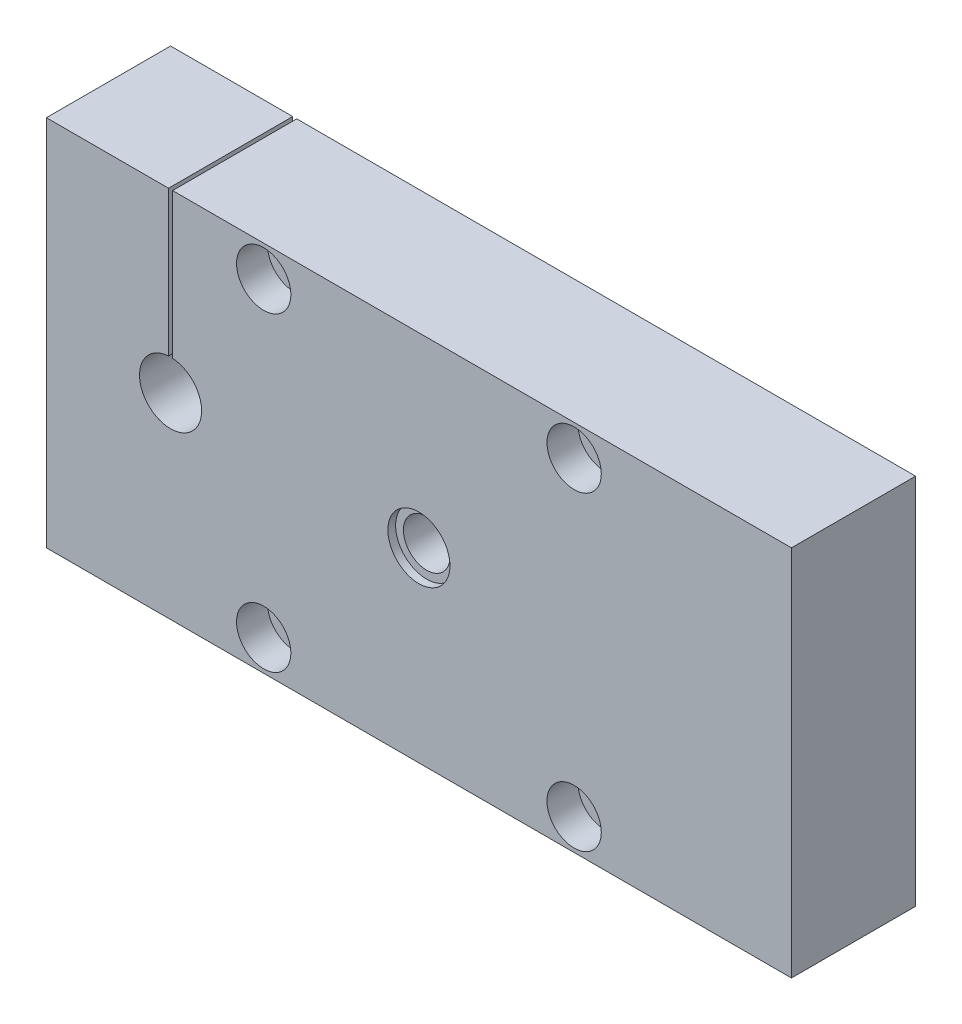
ISO-10303-21;
HEADER;
FILE_DESCRIPTION(('STEP AP214'),'2;1');
FILE_NAME('part.step','',(''),(''),'','','');
FILE_SCHEMA(('AUTOMOTIVE_DESIGN { 1 0 10303 214 1 1 1 1 }'));
ENDSEC;
DATA;
#1=APPLICATION_CONTEXT('core data for automotive mechanical design processes');
#2=APPLICATION_PROTOCOL_DEFINITION('international standard','automotive_design',2000,#1);
#3=PRODUCT_CONTEXT('',#1,'mechanical');
#4=PRODUCT('Part','Part','',(#3));
#5=PRODUCT_RELATED_PRODUCT_CATEGORY('part','',(#4));
#6=PRODUCT_DEFINITION_FORMATION('','',#4);
#7=PRODUCT_DEFINITION_CONTEXT('part definition',#1,'design');
#8=PRODUCT_DEFINITION('design','',#6,#7);
#9=PRODUCT_DEFINITION_SHAPE('','',#8);
#10=(LENGTH_UNIT() NAMED_UNIT(*) SI_UNIT(.MILLI.,.METRE.));
#11=(NAMED_UNIT(*) PLANE_ANGLE_UNIT() SI_UNIT($,.RADIAN.));
#12=(NAMED_UNIT(*) SI_UNIT($,.STERADIAN.) SOLID_ANGLE_UNIT());
#13=UNCERTAINTY_MEASURE_WITH_UNIT(LENGTH_MEASURE(1.E-05),#10,'distance_accuracy_value','');
#14=(GEOMETRIC_REPRESENTATION_CONTEXT(3) GLOBAL_UNCERTAINTY_ASSIGNED_CONTEXT((#13)) GLOBAL_UNIT_ASSIGNED_CONTEXT((#10,
#11,#12)) REPRESENTATION_CONTEXT('',''));
#15=CARTESIAN_POINT('',(0.,0.,0.));
#16=DIRECTION('',(0.,0.,1.));
#17=DIRECTION('',(1.,0.,0.));
#18=AXIS2_PLACEMENT_3D('',#15,#16,#17);
#19=CARTESIAN_POINT('',(-75.7895546636086,70.262996941896,25.4));
#20=DIRECTION('',(0.,-1.,0.));
#21=DIRECTION('',(0.,0.,-1.));
#22=AXIS2_PLACEMENT_3D('',#19,#20,#21);
#23=PLANE('',#22);
#24=DIRECTION('',(-1.,0.,0.));
#25=VECTOR('',#24,1.);
#26=CARTESIAN_POINT('',(-75.7895546636086,70.262996941896,25.4));
#27=LINE('',#26,#25);
#28=CARTESIAN_POINT('',(-50.8023046636086,70.262996941896,25.4));
#29=VERTEX_POINT('',#28);
#30=CARTESIAN_POINT('',(-75.7895546636086,70.262996941896,25.4));
#31=VERTEX_POINT('',#30);
#32=EDGE_CURVE('E165',#29,#31,#27,.T.);
#33=ORIENTED_EDGE('',*,*,#32,.F.);
#34=DIRECTION('',(0.,0.,1.));
#35=VECTOR('',#34,1.);
#36=CARTESIAN_POINT('',(-50.8023046636086,70.262996941896,0.));
#37=LINE('',#36,#35);
#38=CARTESIAN_POINT('',(-50.8023046636086,70.262996941896,0.));
#39=VERTEX_POINT('',#38);
#40=EDGE_CURVE('E565',#39,#29,#37,.T.);
#41=ORIENTED_EDGE('',*,*,#40,.F.);
#42=DIRECTION('',(-1.,0.,0.));
#43=VECTOR('',#42,1.);
#44=CARTESIAN_POINT('',(-75.7895546636086,70.262996941896,0.));
#45=LINE('',#44,#43);
#46=CARTESIAN_POINT('',(-75.7895546636086,70.262996941896,0.));
#47=VERTEX_POINT('',#46);
#48=EDGE_CURVE('E137',#39,#47,#45,.T.);
#49=ORIENTED_EDGE('',*,*,#48,.T.);
#50=DIRECTION('',(0.,0.,-1.));
#51=VECTOR('',#50,1.);
#52=CARTESIAN_POINT('',(-75.7895546636086,70.262996941896,25.4));
#53=LINE('',#52,#51);
#54=EDGE_CURVE('E169',#31,#47,#53,.T.);
#55=ORIENTED_EDGE('',*,*,#54,.F.);
#56=EDGE_LOOP('',(#33,#41,#49,#55));
#57=FACE_BOUND('',#56,.T.);
#58=ADVANCED_FACE('F33',(#57),#23,.F.);
#59=CARTESIAN_POINT('',(0.410445336391438,32.162996941896,25.4));
#60=DIRECTION('',(0.,0.,1.));
#61=DIRECTION('',(1.,0.,0.));
#62=AXIS2_PLACEMENT_3D('',#59,#60,#61);
#63=CYLINDRICAL_SURFACE('',#62,4.76250000000001);
#64=CARTESIAN_POINT('',(0.410445336391438,32.162996941896,23.8125));
#65=DIRECTION('',(0.,0.,1.));
#66=DIRECTION('',(1.,0.,0.));
#67=AXIS2_PLACEMENT_3D('',#64,#65,#66);
#68=CIRCLE('',#67,4.76250000000001);
#69=CARTESIAN_POINT('',(5.17294533639145,32.162996941896,23.8125));
#70=VERTEX_POINT('',#69);
#71=EDGE_CURVE('E153',#70,#70,#68,.T.);
#72=ORIENTED_EDGE('',*,*,#71,.T.);
#73=EDGE_LOOP('',(#72));
#74=FACE_BOUND('',#73,.T.);
#75=CARTESIAN_POINT('',(0.410445336391438,32.162996941896,12.7));
#76=DIRECTION('',(0.,0.,-1.));
#77=DIRECTION('',(-1.,0.,0.));
#78=AXIS2_PLACEMENT_3D('',#75,#76,#77);
#79=CIRCLE('',#78,4.76250000000001);
#80=CARTESIAN_POINT('',(-4.35205466360857,32.162996941896,12.7));
#81=VERTEX_POINT('',#80);
#82=EDGE_CURVE('E37',#81,#81,#79,.F.);
#83=ORIENTED_EDGE('',*,*,#82,.F.);
#84=EDGE_LOOP('',(#83));
#85=FACE_BOUND('',#84,.T.);
#86=ADVANCED_FACE('F323',(#74,#85),#63,.F.);
#87=CARTESIAN_POINT('',(-75.7895546636086,70.262996941896,25.4));
#88=DIRECTION('',(1.,0.,0.));
#89=DIRECTION('',(0.,1.,0.));
#90=AXIS2_PLACEMENT_3D('',#87,#88,#89);
#91=PLANE('',#90);
#92=DIRECTION('',(0.,-1.,0.));
#93=VECTOR('',#92,1.);
#94=CARTESIAN_POINT('',(-75.7895546636086,70.262996941896,0.));
#95=LINE('',#94,#93);
#96=CARTESIAN_POINT('',(-75.7895546636086,-5.93700305810398,0.));
#97=VERTEX_POINT('',#96);
#98=EDGE_CURVE('E156',#47,#97,#95,.T.);
#99=ORIENTED_EDGE('',*,*,#98,.T.);
#100=DIRECTION('',(0.,0.,-1.));
#101=VECTOR('',#100,1.);
#102=CARTESIAN_POINT('',(-75.7895546636086,-5.93700305810398,25.4));
#103=LINE('',#102,#101);
#104=CARTESIAN_POINT('',(-75.7895546636086,-5.93700305810398,25.4));
#105=VERTEX_POINT('',#104);
#106=EDGE_CURVE('E11',#105,#97,#103,.T.);
#107=ORIENTED_EDGE('',*,*,#106,.F.);
#108=DIRECTION('',(0.,-1.,0.));
#109=VECTOR('',#108,1.);
#110=CARTESIAN_POINT('',(-75.7895546636086,70.262996941896,25.4));
#111=LINE('',#110,#109);
#112=EDGE_CURVE('E157',#31,#105,#111,.T.);
#113=ORIENTED_EDGE('',*,*,#112,.F.);
#114=ORIENTED_EDGE('',*,*,#54,.T.);
#115=EDGE_LOOP('',(#99,#107,#113,#114));
#116=FACE_BOUND('',#115,.T.);
#117=ADVANCED_FACE('F35',(#116),#91,.F.);
#118=CARTESIAN_POINT('',(-75.7895546636086,-5.93700305810398,25.4));
#119=DIRECTION('',(0.,1.,0.));
#120=DIRECTION('',(0.,0.,1.));
#121=AXIS2_PLACEMENT_3D('',#118,#119,#120);
#122=PLANE('',#121);
#123=DIRECTION('',(1.,0.,0.));
#124=VECTOR('',#123,1.);
#125=CARTESIAN_POINT('',(-75.7895546636086,-5.93700305810398,0.));
#126=LINE('',#125,#124);
#127=CARTESIAN_POINT('',(-12.2895546636086,-5.93700305810398,0.));
#128=VERTEX_POINT('',#127);
#129=EDGE_CURVE('E173',#97,#128,#126,.T.);
#130=ORIENTED_EDGE('',*,*,#129,.T.);
#131=DIRECTION('',(0.,0.,-1.));
#132=VECTOR('',#131,1.);
#133=CARTESIAN_POINT('',(-12.2895546636086,-5.93700305810398,12.7));
#134=LINE('',#133,#132);
#135=CARTESIAN_POINT('',(-12.2895546636086,-5.93700305810398,12.7));
#136=VERTEX_POINT('',#135);
#137=EDGE_CURVE('E228',#136,#128,#134,.T.);
#138=ORIENTED_EDGE('',*,*,#137,.F.);
#139=DIRECTION('',(-1.,0.,0.));
#140=VECTOR('',#139,1.);
#141=CARTESIAN_POINT('',(13.1104453363914,-5.93700305810398,12.7));
#142=LINE('',#141,#140);
#143=CARTESIAN_POINT('',(13.1104453363914,-5.93700305810398,12.7));
#144=VERTEX_POINT('',#143);
#145=EDGE_CURVE('E571',#144,#136,#142,.T.);
#146=ORIENTED_EDGE('',*,*,#145,.F.);
#147=DIRECTION('',(0.,0.,-1.));
#148=VECTOR('',#147,1.);
#149=CARTESIAN_POINT('',(13.1104453363914,-5.93700305810398,12.7));
#150=LINE('',#149,#148);
#151=CARTESIAN_POINT('',(13.1104453363914,-5.93700305810398,0.));
#152=VERTEX_POINT('',#151);
#153=EDGE_CURVE('E230',#144,#152,#150,.T.);
#154=ORIENTED_EDGE('',*,*,#153,.T.);
#155=CARTESIAN_POINT('',(76.6104453363914,-5.93700305810398,0.));
#156=VERTEX_POINT('',#155);
#157=EDGE_CURVE('E172',#152,#156,#126,.T.);
#158=ORIENTED_EDGE('',*,*,#157,.T.);
#159=DIRECTION('',(0.,0.,-1.));
#160=VECTOR('',#159,1.);
#161=CARTESIAN_POINT('',(76.6104453363914,-5.93700305810398,25.4));
#162=LINE('',#161,#160);
#163=CARTESIAN_POINT('',(76.6104453363914,-5.93700305810398,25.4));
#164=VERTEX_POINT('',#163);
#165=EDGE_CURVE('E42',#164,#156,#162,.T.);
#166=ORIENTED_EDGE('',*,*,#165,.F.);
#167=DIRECTION('',(1.,0.,0.));
#168=VECTOR('',#167,1.);
#169=CARTESIAN_POINT('',(-75.7895546636086,-5.93700305810398,25.4));
#170=LINE('',#169,#168);
#171=EDGE_CURVE('E160',#105,#164,#170,.T.);
#172=ORIENTED_EDGE('',*,*,#171,.F.);
#173=ORIENTED_EDGE('',*,*,#106,.T.);
#174=EDGE_LOOP('',(#130,#138,#146,#154,#158,#166,#172,#173));
#175=FACE_BOUND('',#174,.T.);
#176=ADVANCED_FACE('F207',(#175),#122,.F.);
#177=CARTESIAN_POINT('',(76.6104453363914,70.262996941896,25.4));
#178=DIRECTION('',(-1.,0.,0.));
#179=DIRECTION('',(0.,-1.,0.));
#180=AXIS2_PLACEMENT_3D('',#177,#178,#179);
#181=PLANE('',#180);
#182=DIRECTION('',(0.,1.,0.));
#183=VECTOR('',#182,1.);
#184=CARTESIAN_POINT('',(76.6104453363914,70.262996941896,0.));
#185=LINE('',#184,#183);
#186=CARTESIAN_POINT('',(76.6104453363914,70.262996941896,0.));
#187=VERTEX_POINT('',#186);
#188=EDGE_CURVE('E176',#156,#187,#185,.T.);
#189=ORIENTED_EDGE('',*,*,#188,.T.);
#190=DIRECTION('',(0.,0.,-1.));
#191=VECTOR('',#190,1.);
#192=CARTESIAN_POINT('',(76.6104453363914,70.262996941896,25.4));
#193=LINE('',#192,#191);
#194=CARTESIAN_POINT('',(76.6104453363914,70.262996941896,25.4));
#195=VERTEX_POINT('',#194);
#196=EDGE_CURVE('E182',#195,#187,#193,.T.);
#197=ORIENTED_EDGE('',*,*,#196,.F.);
#198=DIRECTION('',(0.,1.,0.));
#199=VECTOR('',#198,1.);
#200=CARTESIAN_POINT('',(76.6104453363914,70.262996941896,25.4));
#201=LINE('',#200,#199);
#202=EDGE_CURVE('E163',#164,#195,#201,.T.);
#203=ORIENTED_EDGE('',*,*,#202,.F.);
#204=ORIENTED_EDGE('',*,*,#165,.T.);
#205=EDGE_LOOP('',(#189,#197,#203,#204));
#206=FACE_BOUND('',#205,.T.);
#207=ADVANCED_FACE('F190',(#206),#181,.F.);
#208=CARTESIAN_POINT('',(-49.9768046636086,70.262996941896,0.));
#209=VERTEX_POINT('',#208);
#210=EDGE_CURVE('E161',#187,#209,#45,.T.);
#211=ORIENTED_EDGE('',*,*,#210,.T.);
#212=DIRECTION('',(0.,0.,1.));
#213=VECTOR('',#212,1.);
#214=CARTESIAN_POINT('',(-49.9768046636086,70.262996941896,0.));
#215=LINE('',#214,#213);
#216=CARTESIAN_POINT('',(-49.9768046636086,70.262996941896,25.4));
#217=VERTEX_POINT('',#216);
#218=EDGE_CURVE('E200',#209,#217,#215,.T.);
#219=ORIENTED_EDGE('',*,*,#218,.T.);
#220=EDGE_CURVE('E166',#195,#217,#27,.T.);
#221=ORIENTED_EDGE('',*,*,#220,.F.);
#222=ORIENTED_EDGE('',*,*,#196,.T.);
#223=EDGE_LOOP('',(#211,#219,#221,#222));
#224=FACE_BOUND('',#223,.T.);
#225=ADVANCED_FACE('F198',(#224),#23,.F.);
#226=CARTESIAN_POINT('',(-75.7895546636086,-5.93700305810398,25.4));
#227=DIRECTION('',(0.,0.,1.));
#228=DIRECTION('',(1.,0.,0.));
#229=AXIS2_PLACEMENT_3D('',#226,#227,#228);
#230=PLANE('',#229);
#231=DIRECTION('',(0.,-1.,0.));
#232=VECTOR('',#231,1.);
#233=CARTESIAN_POINT('',(-50.8023046636086,40.5442683679513,25.4));
#234=LINE('',#233,#232);
#235=CARTESIAN_POINT('',(-50.8023046636084,40.5442683679513,25.4));
#236=VERTEX_POINT('',#235);
#237=EDGE_CURVE('E49',#29,#236,#234,.T.);
#238=ORIENTED_EDGE('',*,*,#237,.F.);
#239=ORIENTED_EDGE('',*,*,#32,.T.);
#240=ORIENTED_EDGE('',*,*,#112,.T.);
#241=ORIENTED_EDGE('',*,*,#171,.T.);
#242=ORIENTED_EDGE('',*,*,#202,.T.);
#243=ORIENTED_EDGE('',*,*,#220,.T.);
#244=DIRECTION('',(0.,1.,0.));
#245=VECTOR('',#244,1.);
#246=CARTESIAN_POINT('',(-49.9768046636086,40.5442683679513,25.4));
#247=LINE('',#246,#245);
#248=CARTESIAN_POINT('',(-49.9768046636086,40.5442683679513,25.4));
#249=VERTEX_POINT('',#248);
#250=EDGE_CURVE('E138',#249,#217,#247,.T.);
#251=ORIENTED_EDGE('',*,*,#250,.F.);
#252=CARTESIAN_POINT('',(-50.3895546636086,34.207696941896,25.4));
#253=DIRECTION('',(0.,0.,1.));
#254=DIRECTION('',(1.,0.,0.));
#255=AXIS2_PLACEMENT_3D('',#252,#253,#254);
#256=CIRCLE('',#255,6.35);
#257=EDGE_CURVE('E142',#236,#249,#256,.T.);
#258=ORIENTED_EDGE('',*,*,#257,.F.);
#259=EDGE_LOOP('',(#238,#239,#240,#241,#242,#243,#251,#258));
#260=FACE_BOUND('',#259,.T.);
#261=CARTESIAN_POINT('',(-31.3395546636086,63.912996941896,25.4));
#262=DIRECTION('',(0.,0.,1.));
#263=DIRECTION('',(1.,0.,0.));
#264=AXIS2_PLACEMENT_3D('',#261,#262,#263);
#265=CIRCLE('',#264,5.55625);
#266=CARTESIAN_POINT('',(-25.7833046636086,63.912996941896,25.4));
#267=VERTEX_POINT('',#266);
#268=EDGE_CURVE('E237',#267,#267,#265,.T.);
#269=ORIENTED_EDGE('',*,*,#268,.F.);
#270=EDGE_LOOP('',(#269));
#271=FACE_BOUND('',#270,.T.);
#272=CARTESIAN_POINT('',(-31.3395546636086,0.412996941896018,25.4));
#273=DIRECTION('',(0.,0.,1.));
#274=DIRECTION('',(1.,0.,0.));
#275=AXIS2_PLACEMENT_3D('',#272,#273,#274);
#276=CIRCLE('',#275,5.55625);
#277=CARTESIAN_POINT('',(-25.7833046636086,0.412996941896018,25.4));
#278=VERTEX_POINT('',#277);
#279=EDGE_CURVE('E249',#278,#278,#276,.T.);
#280=ORIENTED_EDGE('',*,*,#279,.F.);
#281=EDGE_LOOP('',(#280));
#282=FACE_BOUND('',#281,.T.);
#283=CARTESIAN_POINT('',(32.1604453363914,0.412996941896018,25.4));
#284=DIRECTION('',(0.,0.,1.));
#285=DIRECTION('',(1.,0.,0.));
#286=AXIS2_PLACEMENT_3D('',#283,#284,#285);
#287=CIRCLE('',#286,5.55625);
#288=CARTESIAN_POINT('',(37.7166953363914,0.412996941896018,25.4));
#289=VERTEX_POINT('',#288);
#290=EDGE_CURVE('E261',#289,#289,#287,.T.);
#291=ORIENTED_EDGE('',*,*,#290,.F.);
#292=EDGE_LOOP('',(#291));
#293=FACE_BOUND('',#292,.T.);
#294=CARTESIAN_POINT('',(32.1604453363914,63.912996941896,25.4));
#295=DIRECTION('',(0.,0.,1.));
#296=DIRECTION('',(1.,0.,0.));
#297=AXIS2_PLACEMENT_3D('',#294,#295,#296);
#298=CIRCLE('',#297,5.55625);
#299=CARTESIAN_POINT('',(37.7166953363914,63.912996941896,25.4));
#300=VERTEX_POINT('',#299);
#301=EDGE_CURVE('E273',#300,#300,#298,.T.);
#302=ORIENTED_EDGE('',*,*,#301,.F.);
#303=EDGE_LOOP('',(#302));
#304=FACE_BOUND('',#303,.T.);
#305=CARTESIAN_POINT('',(0.410445336391438,32.162996941896,25.4));
#306=DIRECTION('',(0.,0.,1.));
#307=DIRECTION('',(1.,0.,0.));
#308=AXIS2_PLACEMENT_3D('',#305,#306,#307);
#309=CIRCLE('',#308,6.35000000000001);
#310=CARTESIAN_POINT('',(6.76044533639145,32.162996941896,25.4));
#311=VERTEX_POINT('',#310);
#312=EDGE_CURVE('E141',#311,#311,#309,.T.);
#313=ORIENTED_EDGE('',*,*,#312,.F.);
#314=EDGE_LOOP('',(#313));
#315=FACE_BOUND('',#314,.T.);
#316=ADVANCED_FACE('F203',(#260,#271,#282,#293,#304,#315),#230,.T.);
#317=CARTESIAN_POINT('',(-75.7895546636086,-5.93700305810398,0.));
#318=DIRECTION('',(0.,0.,1.));
#319=DIRECTION('',(1.,0.,0.));
#320=AXIS2_PLACEMENT_3D('',#317,#318,#319);
#321=PLANE('',#320);
#322=CARTESIAN_POINT('',(-31.3395546636086,63.912996941896,0.));
#323=DIRECTION('',(0.,0.,1.));
#324=DIRECTION('',(1.,0.,0.));
#325=AXIS2_PLACEMENT_3D('',#322,#323,#324);
#326=CIRCLE('',#325,3.37819999999999);
#327=CARTESIAN_POINT('',(-27.9613546636086,63.912996941896,0.));
#328=VERTEX_POINT('',#327);
#329=EDGE_CURVE('E246',#328,#328,#326,.T.);
#330=ORIENTED_EDGE('',*,*,#329,.T.);
#331=EDGE_LOOP('',(#330));
#332=FACE_BOUND('',#331,.T.);
#333=CARTESIAN_POINT('',(-31.3395546636086,0.412996941896018,0.));
#334=DIRECTION('',(0.,0.,1.));
#335=DIRECTION('',(1.,0.,0.));
#336=AXIS2_PLACEMENT_3D('',#333,#334,#335);
#337=CIRCLE('',#336,3.37819999999999);
#338=CARTESIAN_POINT('',(-27.9613546636086,0.412996941896018,0.));
#339=VERTEX_POINT('',#338);
#340=EDGE_CURVE('E258',#339,#339,#337,.T.);
#341=ORIENTED_EDGE('',*,*,#340,.T.);
#342=EDGE_LOOP('',(#341));
#343=FACE_BOUND('',#342,.T.);
#344=CARTESIAN_POINT('',(32.1604453363914,0.412996941896018,0.));
#345=DIRECTION('',(0.,0.,1.));
#346=DIRECTION('',(1.,0.,0.));
#347=AXIS2_PLACEMENT_3D('',#344,#345,#346);
#348=CIRCLE('',#347,3.37819999999999);
#349=CARTESIAN_POINT('',(35.5386453363914,0.412996941896018,0.));
#350=VERTEX_POINT('',#349);
#351=EDGE_CURVE('E270',#350,#350,#348,.T.);
#352=ORIENTED_EDGE('',*,*,#351,.T.);
#353=EDGE_LOOP('',(#352));
#354=FACE_BOUND('',#353,.T.);
#355=CARTESIAN_POINT('',(32.1604453363914,63.912996941896,0.));
#356=DIRECTION('',(0.,0.,1.));
#357=DIRECTION('',(1.,0.,0.));
#358=AXIS2_PLACEMENT_3D('',#355,#356,#357);
#359=CIRCLE('',#358,3.37819999999999);
#360=CARTESIAN_POINT('',(35.5386453363914,63.912996941896,0.));
#361=VERTEX_POINT('',#360);
#362=EDGE_CURVE('E147',#361,#361,#359,.T.);
#363=ORIENTED_EDGE('',*,*,#362,.T.);
#364=EDGE_LOOP('',(#363));
#365=FACE_BOUND('',#364,.T.);
#366=ORIENTED_EDGE('',*,*,#48,.F.);
#367=DIRECTION('',(0.,-1.,0.));
#368=VECTOR('',#367,1.);
#369=CARTESIAN_POINT('',(-50.8023046636086,40.5442683679513,0.));
#370=LINE('',#369,#368);
#371=CARTESIAN_POINT('',(-50.8023046636086,40.5442683679513,0.));
#372=VERTEX_POINT('',#371);
#373=EDGE_CURVE('E123',#39,#372,#370,.T.);
#374=ORIENTED_EDGE('',*,*,#373,.T.);
#375=CARTESIAN_POINT('',(-50.3895546636086,34.207696941896,0.));
#376=DIRECTION('',(0.,0.,1.));
#377=DIRECTION('',(1.,0.,0.));
#378=AXIS2_PLACEMENT_3D('',#375,#376,#377);
#379=CIRCLE('',#378,6.34999999999999);
#380=CARTESIAN_POINT('',(-49.9768046636086,40.5442683679513,0.));
#381=VERTEX_POINT('',#380);
#382=EDGE_CURVE('E135',#372,#381,#379,.T.);
#383=ORIENTED_EDGE('',*,*,#382,.T.);
#384=DIRECTION('',(0.,1.,0.));
#385=VECTOR('',#384,1.);
#386=CARTESIAN_POINT('',(-49.9768046636086,40.5442683679513,0.));
#387=LINE('',#386,#385);
#388=EDGE_CURVE('E57',#381,#209,#387,.T.);
#389=ORIENTED_EDGE('',*,*,#388,.T.);
#390=ORIENTED_EDGE('',*,*,#210,.F.);
#391=ORIENTED_EDGE('',*,*,#188,.F.);
#392=ORIENTED_EDGE('',*,*,#157,.F.);
#393=DIRECTION('',(0.,-1.,0.));
#394=VECTOR('',#393,1.);
#395=CARTESIAN_POINT('',(13.1104453363914,32.162996941896,0.));
#396=LINE('',#395,#394);
#397=CARTESIAN_POINT('',(13.1104453363914,32.162996941896,0.));
#398=VERTEX_POINT('',#397);
#399=EDGE_CURVE('E218',#398,#152,#396,.T.);
#400=ORIENTED_EDGE('',*,*,#399,.F.);
#401=CARTESIAN_POINT('',(0.410445336391438,32.162996941896,0.));
#402=DIRECTION('',(0.,0.,-1.));
#403=DIRECTION('',(-1.,0.,0.));
#404=AXIS2_PLACEMENT_3D('',#401,#402,#403);
#405=CIRCLE('',#404,12.7);
#406=CARTESIAN_POINT('',(-12.2895546636086,32.162996941896,0.));
#407=VERTEX_POINT('',#406);
#408=EDGE_CURVE('E215',#407,#398,#405,.T.);
#409=ORIENTED_EDGE('',*,*,#408,.F.);
#410=DIRECTION('',(0.,1.,0.));
#411=VECTOR('',#410,1.);
#412=CARTESIAN_POINT('',(-12.2895546636086,32.162996941896,0.));
#413=LINE('',#412,#411);
#414=EDGE_CURVE('E214',#128,#407,#413,.T.);
#415=ORIENTED_EDGE('',*,*,#414,.F.);
#416=ORIENTED_EDGE('',*,*,#129,.F.);
#417=ORIENTED_EDGE('',*,*,#98,.F.);
#418=EDGE_LOOP('',(#366,#374,#383,#389,#390,#391,#392,#400,#409,#415,#416,#417));
#419=FACE_BOUND('',#418,.T.);
#420=ADVANCED_FACE('F134',(#332,#343,#354,#365,#419),#321,.F.);
#421=CARTESIAN_POINT('',(5.17294533639145,32.162996941896,23.8125));
#422=DIRECTION('',(0.,0.,-1.));
#423=DIRECTION('',(-1.,0.,0.));
#424=AXIS2_PLACEMENT_3D('',#421,#422,#423);
#425=PLANE('',#424);
#426=ORIENTED_EDGE('',*,*,#71,.F.);
#427=EDGE_LOOP('',(#426));
#428=FACE_BOUND('',#427,.T.);
#429=CARTESIAN_POINT('',(0.410445336391438,32.162996941896,23.8125));
#430=DIRECTION('',(0.,0.,1.));
#431=DIRECTION('',(1.,0.,0.));
#432=AXIS2_PLACEMENT_3D('',#429,#430,#431);
#433=CIRCLE('',#432,6.35000000000001);
#434=CARTESIAN_POINT('',(6.76044533639145,32.162996941896,23.8125));
#435=VERTEX_POINT('',#434);
#436=EDGE_CURVE('E145',#435,#435,#433,.T.);
#437=ORIENTED_EDGE('',*,*,#436,.T.);
#438=EDGE_LOOP('',(#437));
#439=FACE_BOUND('',#438,.T.);
#440=ADVANCED_FACE('F311',(#428,#439),#425,.F.);
#441=CARTESIAN_POINT('',(0.410445336391438,32.162996941896,25.4));
#442=DIRECTION('',(0.,0.,1.));
#443=DIRECTION('',(1.,0.,0.));
#444=AXIS2_PLACEMENT_3D('',#441,#442,#443);
#445=CYLINDRICAL_SURFACE('',#444,6.35000000000001);
#446=ORIENTED_EDGE('',*,*,#436,.F.);
#447=EDGE_LOOP('',(#446));
#448=FACE_BOUND('',#447,.T.);
#449=ORIENTED_EDGE('',*,*,#312,.T.);
#450=EDGE_LOOP('',(#449));
#451=FACE_BOUND('',#450,.T.);
#452=ADVANCED_FACE('F309',(#448,#451),#445,.F.);
#453=CARTESIAN_POINT('',(-50.3895546636086,34.207696941896,25.4));
#454=DIRECTION('',(0.,0.,1.));
#455=DIRECTION('',(1.,0.,0.));
#456=AXIS2_PLACEMENT_3D('',#453,#454,#455);
#457=CYLINDRICAL_SURFACE('',#456,6.35);
#458=ORIENTED_EDGE('',*,*,#257,.T.);
#459=DIRECTION('',(0.,0.,1.));
#460=VECTOR('',#459,1.);
#461=CARTESIAN_POINT('',(-49.9768046636086,40.5442683679513,0.));
#462=LINE('',#461,#460);
#463=EDGE_CURVE('E129',#381,#249,#462,.T.);
#464=ORIENTED_EDGE('',*,*,#463,.F.);
#465=ORIENTED_EDGE('',*,*,#382,.F.);
#466=DIRECTION('',(0.,0.,1.));
#467=VECTOR('',#466,1.);
#468=CARTESIAN_POINT('',(-50.8023046636086,40.5442683679513,0.));
#469=LINE('',#468,#467);
#470=EDGE_CURVE('E120',#372,#236,#469,.T.);
#471=ORIENTED_EDGE('',*,*,#470,.T.);
#472=EDGE_LOOP('',(#458,#464,#465,#471));
#473=FACE_BOUND('',#472,.T.);
#474=ADVANCED_FACE('F140',(#473),#457,.F.);
#475=CARTESIAN_POINT('',(32.1604453363914,63.912996941896,25.4));
#476=DIRECTION('',(0.,0.,1.));
#477=DIRECTION('',(1.,0.,0.));
#478=AXIS2_PLACEMENT_3D('',#475,#476,#477);
#479=CYLINDRICAL_SURFACE('',#478,3.37819999999999);
#480=ORIENTED_EDGE('',*,*,#362,.F.);
#481=EDGE_LOOP('',(#480));
#482=FACE_BOUND('',#481,.T.);
#483=CARTESIAN_POINT('',(32.1604453363914,63.912996941896,19.05));
#484=DIRECTION('',(0.,0.,1.));
#485=DIRECTION('',(1.,0.,0.));
#486=AXIS2_PLACEMENT_3D('',#483,#484,#485);
#487=CIRCLE('',#486,3.3782);
#488=CARTESIAN_POINT('',(35.5386453363914,63.912996941896,19.05));
#489=VERTEX_POINT('',#488);
#490=EDGE_CURVE('E279',#489,#489,#487,.T.);
#491=ORIENTED_EDGE('',*,*,#490,.T.);
#492=EDGE_LOOP('',(#491));
#493=FACE_BOUND('',#492,.T.);
#494=ADVANCED_FACE('F285',(#482,#493),#479,.F.);
#495=CARTESIAN_POINT('',(35.5386453363914,63.912996941896,19.05));
#496=DIRECTION('',(0.,0.,-1.));
#497=DIRECTION('',(-1.,0.,0.));
#498=AXIS2_PLACEMENT_3D('',#495,#496,#497);
#499=PLANE('',#498);
#500=ORIENTED_EDGE('',*,*,#490,.F.);
#501=EDGE_LOOP('',(#500));
#502=FACE_BOUND('',#501,.T.);
#503=CARTESIAN_POINT('',(32.1604453363914,63.912996941896,19.05));
#504=DIRECTION('',(0.,0.,1.));
#505=DIRECTION('',(1.,0.,0.));
#506=AXIS2_PLACEMENT_3D('',#503,#504,#505);
#507=CIRCLE('',#506,5.55625);
#508=CARTESIAN_POINT('',(37.7166953363914,63.912996941896,19.05));
#509=VERTEX_POINT('',#508);
#510=EDGE_CURVE('E276',#509,#509,#507,.T.);
#511=ORIENTED_EDGE('',*,*,#510,.T.);
#512=EDGE_LOOP('',(#511));
#513=FACE_BOUND('',#512,.T.);
#514=ADVANCED_FACE('F288',(#502,#513),#499,.F.);
#515=CARTESIAN_POINT('',(32.1604453363914,63.912996941896,25.4));
#516=DIRECTION('',(0.,0.,1.));
#517=DIRECTION('',(1.,0.,0.));
#518=AXIS2_PLACEMENT_3D('',#515,#516,#517);
#519=CYLINDRICAL_SURFACE('',#518,5.55625);
#520=ORIENTED_EDGE('',*,*,#510,.F.);
#521=EDGE_LOOP('',(#520));
#522=FACE_BOUND('',#521,.T.);
#523=ORIENTED_EDGE('',*,*,#301,.T.);
#524=EDGE_LOOP('',(#523));
#525=FACE_BOUND('',#524,.T.);
#526=ADVANCED_FACE('F294',(#522,#525),#519,.F.);
#527=CARTESIAN_POINT('',(32.1604453363914,0.412996941896018,25.4));
#528=DIRECTION('',(0.,0.,1.));
#529=DIRECTION('',(1.,0.,0.));
#530=AXIS2_PLACEMENT_3D('',#527,#528,#529);
#531=CYLINDRICAL_SURFACE('',#530,3.37819999999999);
#532=ORIENTED_EDGE('',*,*,#351,.F.);
#533=EDGE_LOOP('',(#532));
#534=FACE_BOUND('',#533,.T.);
#535=CARTESIAN_POINT('',(32.1604453363914,0.412996941896018,19.05));
#536=DIRECTION('',(0.,0.,1.));
#537=DIRECTION('',(1.,0.,0.));
#538=AXIS2_PLACEMENT_3D('',#535,#536,#537);
#539=CIRCLE('',#538,3.3782);
#540=CARTESIAN_POINT('',(35.5386453363914,0.412996941896018,19.05));
#541=VERTEX_POINT('',#540);
#542=EDGE_CURVE('E267',#541,#541,#539,.T.);
#543=ORIENTED_EDGE('',*,*,#542,.T.);
#544=EDGE_LOOP('',(#543));
#545=FACE_BOUND('',#544,.T.);
#546=ADVANCED_FACE('F300',(#534,#545),#531,.F.);
#547=CARTESIAN_POINT('',(35.5386453363914,0.412996941896018,19.05));
#548=DIRECTION('',(0.,0.,-1.));
#549=DIRECTION('',(-1.,0.,0.));
#550=AXIS2_PLACEMENT_3D('',#547,#548,#549);
#551=PLANE('',#550);
#552=ORIENTED_EDGE('',*,*,#542,.F.);
#553=EDGE_LOOP('',(#552));
#554=FACE_BOUND('',#553,.T.);
#555=CARTESIAN_POINT('',(32.1604453363914,0.412996941896018,19.05));
#556=DIRECTION('',(0.,0.,1.));
#557=DIRECTION('',(1.,0.,0.));
#558=AXIS2_PLACEMENT_3D('',#555,#556,#557);
#559=CIRCLE('',#558,5.55625);
#560=CARTESIAN_POINT('',(37.7166953363914,0.412996941896018,19.05));
#561=VERTEX_POINT('',#560);
#562=EDGE_CURVE('E264',#561,#561,#559,.T.);
#563=ORIENTED_EDGE('',*,*,#562,.T.);
#564=EDGE_LOOP('',(#563));
#565=FACE_BOUND('',#564,.T.);
#566=ADVANCED_FACE('F414',(#554,#565),#551,.F.);
#567=CARTESIAN_POINT('',(32.1604453363914,0.412996941896018,25.4));
#568=DIRECTION('',(0.,0.,1.));
#569=DIRECTION('',(1.,0.,0.));
#570=AXIS2_PLACEMENT_3D('',#567,#568,#569);
#571=CYLINDRICAL_SURFACE('',#570,5.55625);
#572=ORIENTED_EDGE('',*,*,#562,.F.);
#573=EDGE_LOOP('',(#572));
#574=FACE_BOUND('',#573,.T.);
#575=ORIENTED_EDGE('',*,*,#290,.T.);
#576=EDGE_LOOP('',(#575));
#577=FACE_BOUND('',#576,.T.);
#578=ADVANCED_FACE('F423',(#574,#577),#571,.F.);
#579=CARTESIAN_POINT('',(-31.3395546636086,0.412996941896018,25.4));
#580=DIRECTION('',(0.,0.,1.));
#581=DIRECTION('',(1.,0.,0.));
#582=AXIS2_PLACEMENT_3D('',#579,#580,#581);
#583=CYLINDRICAL_SURFACE('',#582,3.3782);
#584=ORIENTED_EDGE('',*,*,#340,.F.);
#585=EDGE_LOOP('',(#584));
#586=FACE_BOUND('',#585,.T.);
#587=CARTESIAN_POINT('',(-31.3395546636086,0.412996941896018,19.05));
#588=DIRECTION('',(0.,0.,1.));
#589=DIRECTION('',(1.,0.,0.));
#590=AXIS2_PLACEMENT_3D('',#587,#588,#589);
#591=CIRCLE('',#590,3.3782);
#592=CARTESIAN_POINT('',(-27.9613546636086,0.412996941896018,19.05));
#593=VERTEX_POINT('',#592);
#594=EDGE_CURVE('E255',#593,#593,#591,.T.);
#595=ORIENTED_EDGE('',*,*,#594,.T.);
#596=EDGE_LOOP('',(#595));
#597=FACE_BOUND('',#596,.T.);
#598=ADVANCED_FACE('F432',(#586,#597),#583,.F.);
#599=CARTESIAN_POINT('',(-27.9613546636086,0.412996941896018,19.05));
#600=DIRECTION('',(0.,0.,-1.));
#601=DIRECTION('',(-1.,0.,0.));
#602=AXIS2_PLACEMENT_3D('',#599,#600,#601);
#603=PLANE('',#602);
#604=ORIENTED_EDGE('',*,*,#594,.F.);
#605=EDGE_LOOP('',(#604));
#606=FACE_BOUND('',#605,.T.);
#607=CARTESIAN_POINT('',(-31.3395546636086,0.412996941896018,19.05));
#608=DIRECTION('',(0.,0.,1.));
#609=DIRECTION('',(1.,0.,0.));
#610=AXIS2_PLACEMENT_3D('',#607,#608,#609);
#611=CIRCLE('',#610,5.55625);
#612=CARTESIAN_POINT('',(-25.7833046636086,0.412996941896018,19.05));
#613=VERTEX_POINT('',#612);
#614=EDGE_CURVE('E252',#613,#613,#611,.T.);
#615=ORIENTED_EDGE('',*,*,#614,.T.);
#616=EDGE_LOOP('',(#615));
#617=FACE_BOUND('',#616,.T.);
#618=ADVANCED_FACE('F441',(#606,#617),#603,.F.);
#619=CARTESIAN_POINT('',(-31.3395546636086,0.412996941896018,25.4));
#620=DIRECTION('',(0.,0.,1.));
#621=DIRECTION('',(1.,0.,0.));
#622=AXIS2_PLACEMENT_3D('',#619,#620,#621);
#623=CYLINDRICAL_SURFACE('',#622,5.55625);
#624=ORIENTED_EDGE('',*,*,#614,.F.);
#625=EDGE_LOOP('',(#624));
#626=FACE_BOUND('',#625,.T.);
#627=ORIENTED_EDGE('',*,*,#279,.T.);
#628=EDGE_LOOP('',(#627));
#629=FACE_BOUND('',#628,.T.);
#630=ADVANCED_FACE('F450',(#626,#629),#623,.F.);
#631=CARTESIAN_POINT('',(-31.3395546636086,63.912996941896,25.4));
#632=DIRECTION('',(0.,0.,1.));
#633=DIRECTION('',(1.,0.,0.));
#634=AXIS2_PLACEMENT_3D('',#631,#632,#633);
#635=CYLINDRICAL_SURFACE('',#634,3.3782);
#636=ORIENTED_EDGE('',*,*,#329,.F.);
#637=EDGE_LOOP('',(#636));
#638=FACE_BOUND('',#637,.T.);
#639=CARTESIAN_POINT('',(-31.3395546636086,63.912996941896,19.05));
#640=DIRECTION('',(0.,0.,1.));
#641=DIRECTION('',(1.,0.,0.));
#642=AXIS2_PLACEMENT_3D('',#639,#640,#641);
#643=CIRCLE('',#642,3.3782);
#644=CARTESIAN_POINT('',(-27.9613546636086,63.912996941896,19.05));
#645=VERTEX_POINT('',#644);
#646=EDGE_CURVE('E243',#645,#645,#643,.T.);
#647=ORIENTED_EDGE('',*,*,#646,.T.);
#648=EDGE_LOOP('',(#647));
#649=FACE_BOUND('',#648,.T.);
#650=ADVANCED_FACE('F459',(#638,#649),#635,.F.);
#651=CARTESIAN_POINT('',(-27.9613546636086,63.912996941896,19.05));
#652=DIRECTION('',(0.,0.,-1.));
#653=DIRECTION('',(-1.,0.,0.));
#654=AXIS2_PLACEMENT_3D('',#651,#652,#653);
#655=PLANE('',#654);
#656=ORIENTED_EDGE('',*,*,#646,.F.);
#657=EDGE_LOOP('',(#656));
#658=FACE_BOUND('',#657,.T.);
#659=CARTESIAN_POINT('',(-31.3395546636086,63.912996941896,19.05));
#660=DIRECTION('',(0.,0.,1.));
#661=DIRECTION('',(1.,0.,0.));
#662=AXIS2_PLACEMENT_3D('',#659,#660,#661);
#663=CIRCLE('',#662,5.55625);
#664=CARTESIAN_POINT('',(-25.7833046636086,63.912996941896,19.05));
#665=VERTEX_POINT('',#664);
#666=EDGE_CURVE('E240',#665,#665,#663,.T.);
#667=ORIENTED_EDGE('',*,*,#666,.T.);
#668=EDGE_LOOP('',(#667));
#669=FACE_BOUND('',#668,.T.);
#670=ADVANCED_FACE('F468',(#658,#669),#655,.F.);
#671=CARTESIAN_POINT('',(-31.3395546636086,63.912996941896,25.4));
#672=DIRECTION('',(0.,0.,1.));
#673=DIRECTION('',(1.,0.,0.));
#674=AXIS2_PLACEMENT_3D('',#671,#672,#673);
#675=CYLINDRICAL_SURFACE('',#674,5.55625);
#676=ORIENTED_EDGE('',*,*,#666,.F.);
#677=EDGE_LOOP('',(#676));
#678=FACE_BOUND('',#677,.T.);
#679=ORIENTED_EDGE('',*,*,#268,.T.);
#680=EDGE_LOOP('',(#679));
#681=FACE_BOUND('',#680,.T.);
#682=ADVANCED_FACE('F477',(#678,#681),#675,.F.);
#683=CARTESIAN_POINT('',(0.410445336391438,32.162996941896,12.7));
#684=DIRECTION('',(0.,0.,-1.));
#685=DIRECTION('',(-1.,0.,0.));
#686=AXIS2_PLACEMENT_3D('',#683,#684,#685);
#687=PLANE('',#686);
#688=CARTESIAN_POINT('',(0.410445336391438,32.162996941896,12.7));
#689=DIRECTION('',(0.,0.,-1.));
#690=DIRECTION('',(-1.,0.,0.));
#691=AXIS2_PLACEMENT_3D('',#688,#689,#690);
#692=CIRCLE('',#691,12.7);
#693=CARTESIAN_POINT('',(-12.2895546636086,32.162996941896,12.7));
#694=VERTEX_POINT('',#693);
#695=CARTESIAN_POINT('',(13.1104453363914,32.162996941896,12.7));
#696=VERTEX_POINT('',#695);
#697=EDGE_CURVE('E217',#694,#696,#692,.T.);
#698=ORIENTED_EDGE('',*,*,#697,.T.);
#699=DIRECTION('',(0.,-1.,0.));
#700=VECTOR('',#699,1.);
#701=CARTESIAN_POINT('',(13.1104453363914,32.162996941896,12.7));
#702=LINE('',#701,#700);
#703=EDGE_CURVE('E221',#696,#144,#702,.T.);
#704=ORIENTED_EDGE('',*,*,#703,.T.);
#705=ORIENTED_EDGE('',*,*,#145,.T.);
#706=DIRECTION('',(0.,1.,0.));
#707=VECTOR('',#706,1.);
#708=CARTESIAN_POINT('',(-12.2895546636086,32.162996941896,12.7));
#709=LINE('',#708,#707);
#710=EDGE_CURVE('E236',#136,#694,#709,.T.);
#711=ORIENTED_EDGE('',*,*,#710,.T.);
#712=EDGE_LOOP('',(#698,#704,#705,#711));
#713=FACE_BOUND('',#712,.T.);
#714=ORIENTED_EDGE('',*,*,#82,.T.);
#715=EDGE_LOOP('',(#714));
#716=FACE_BOUND('',#715,.T.);
#717=ADVANCED_FACE('F486',(#713,#716),#687,.T.);
#718=CARTESIAN_POINT('',(0.410445336391438,32.162996941896,12.7));
#719=DIRECTION('',(0.,0.,-1.));
#720=DIRECTION('',(-1.,0.,0.));
#721=AXIS2_PLACEMENT_3D('',#718,#719,#720);
#722=CYLINDRICAL_SURFACE('',#721,12.7);
#723=ORIENTED_EDGE('',*,*,#408,.T.);
#724=DIRECTION('',(0.,0.,-1.));
#725=VECTOR('',#724,1.);
#726=CARTESIAN_POINT('',(13.1104453363914,32.162996941896,12.7));
#727=LINE('',#726,#725);
#728=EDGE_CURVE('E233',#696,#398,#727,.T.);
#729=ORIENTED_EDGE('',*,*,#728,.F.);
#730=ORIENTED_EDGE('',*,*,#697,.F.);
#731=DIRECTION('',(0.,0.,-1.));
#732=VECTOR('',#731,1.);
#733=CARTESIAN_POINT('',(-12.2895546636086,32.162996941896,12.7));
#734=LINE('',#733,#732);
#735=EDGE_CURVE('E226',#694,#407,#734,.T.);
#736=ORIENTED_EDGE('',*,*,#735,.T.);
#737=EDGE_LOOP('',(#723,#729,#730,#736));
#738=FACE_BOUND('',#737,.T.);
#739=ADVANCED_FACE('F498',(#738),#722,.F.);
#740=CARTESIAN_POINT('',(-12.2895546636086,32.162996941896,12.7));
#741=DIRECTION('',(-1.,0.,0.));
#742=DIRECTION('',(0.,-1.,0.));
#743=AXIS2_PLACEMENT_3D('',#740,#741,#742);
#744=PLANE('',#743);
#745=ORIENTED_EDGE('',*,*,#414,.T.);
#746=ORIENTED_EDGE('',*,*,#735,.F.);
#747=ORIENTED_EDGE('',*,*,#710,.F.);
#748=ORIENTED_EDGE('',*,*,#137,.T.);
#749=EDGE_LOOP('',(#745,#746,#747,#748));
#750=FACE_BOUND('',#749,.T.);
#751=ADVANCED_FACE('F507',(#750),#744,.F.);
#752=CARTESIAN_POINT('',(13.1104453363914,32.162996941896,12.7));
#753=DIRECTION('',(1.,0.,0.));
#754=DIRECTION('',(0.,1.,0.));
#755=AXIS2_PLACEMENT_3D('',#752,#753,#754);
#756=PLANE('',#755);
#757=ORIENTED_EDGE('',*,*,#399,.T.);
#758=ORIENTED_EDGE('',*,*,#153,.F.);
#759=ORIENTED_EDGE('',*,*,#703,.F.);
#760=ORIENTED_EDGE('',*,*,#728,.T.);
#761=EDGE_LOOP('',(#757,#758,#759,#760));
#762=FACE_BOUND('',#761,.T.);
#763=ADVANCED_FACE('F516',(#762),#756,.F.);
#764=CARTESIAN_POINT('',(-50.8023046636086,40.5442683679513,0.));
#765=DIRECTION('',(-1.,0.,0.));
#766=DIRECTION('',(0.,0.,1.));
#767=AXIS2_PLACEMENT_3D('',#764,#765,#766);
#768=PLANE('',#767);
#769=ORIENTED_EDGE('',*,*,#237,.T.);
#770=ORIENTED_EDGE('',*,*,#470,.F.);
#771=ORIENTED_EDGE('',*,*,#373,.F.);
#772=ORIENTED_EDGE('',*,*,#40,.T.);
#773=EDGE_LOOP('',(#769,#770,#771,#772));
#774=FACE_BOUND('',#773,.T.);
#775=ADVANCED_FACE('F122',(#774),#768,.F.);
#776=CARTESIAN_POINT('',(-49.9768046636086,40.5442683679513,0.));
#777=DIRECTION('',(1.,0.,0.));
#778=DIRECTION('',(0.,0.,-1.));
#779=AXIS2_PLACEMENT_3D('',#776,#777,#778);
#780=PLANE('',#779);
#781=ORIENTED_EDGE('',*,*,#250,.T.);
#782=ORIENTED_EDGE('',*,*,#218,.F.);
#783=ORIENTED_EDGE('',*,*,#388,.F.);
#784=ORIENTED_EDGE('',*,*,#463,.T.);
#785=EDGE_LOOP('',(#781,#782,#783,#784));
#786=FACE_BOUND('',#785,.T.);
#787=ADVANCED_FACE('F533',(#786),#780,.F.);
#788=CLOSED_SHELL('',(#58,#86,#117,#176,#207,#225,#316,#420,#440,#452,#474,#494,#514,#526,#546,
#566,#578,#598,#618,#630,#650,#670,#682,#717,#739,#751,#763,#775,#787));
#789=MANIFOLD_SOLID_BREP('B2',#788);
#790=ADVANCED_BREP_SHAPE_REPRESENTATION('',(#18,#789),#14);
#791=SHAPE_DEFINITION_REPRESENTATION(#9,#790);
ENDSEC;
END-ISO-10303-21;
